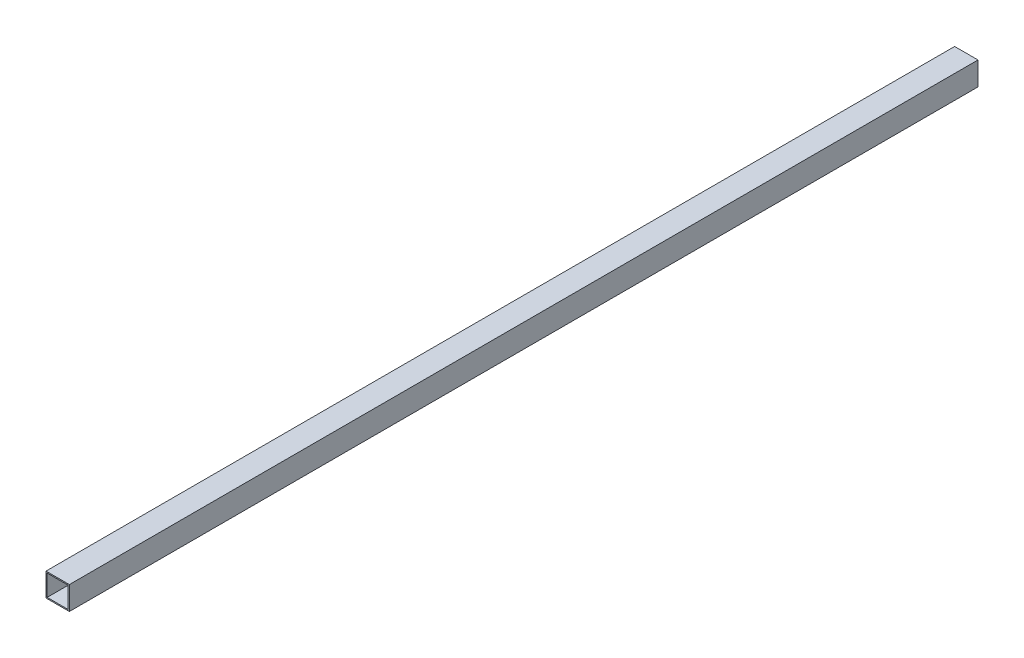
ISO-10303-21;
HEADER;
FILE_DESCRIPTION(('STEP AP214'),'2;1');
FILE_NAME('part.step','',(''),(''),'','','');
FILE_SCHEMA(('AUTOMOTIVE_DESIGN { 1 0 10303 214 1 1 1 1 }'));
ENDSEC;
DATA;
#1=APPLICATION_CONTEXT('core data for automotive mechanical design processes');
#2=APPLICATION_PROTOCOL_DEFINITION('international standard','automotive_design',2000,#1);
#3=PRODUCT_CONTEXT('',#1,'mechanical');
#4=PRODUCT('Part','Part','',(#3));
#5=PRODUCT_RELATED_PRODUCT_CATEGORY('part','',(#4));
#6=PRODUCT_DEFINITION_FORMATION('','',#4);
#7=PRODUCT_DEFINITION_CONTEXT('part definition',#1,'design');
#8=PRODUCT_DEFINITION('design','',#6,#7);
#9=PRODUCT_DEFINITION_SHAPE('','',#8);
#10=(LENGTH_UNIT() NAMED_UNIT(*) SI_UNIT(.MILLI.,.METRE.));
#11=(NAMED_UNIT(*) PLANE_ANGLE_UNIT() SI_UNIT($,.RADIAN.));
#12=(NAMED_UNIT(*) SI_UNIT($,.STERADIAN.) SOLID_ANGLE_UNIT());
#13=UNCERTAINTY_MEASURE_WITH_UNIT(LENGTH_MEASURE(1.E-05),#10,'distance_accuracy_value','');
#14=(GEOMETRIC_REPRESENTATION_CONTEXT(3) GLOBAL_UNCERTAINTY_ASSIGNED_CONTEXT((#13)) GLOBAL_UNIT_ASSIGNED_CONTEXT((#10,
#11,#12)) REPRESENTATION_CONTEXT('',''));
#15=CARTESIAN_POINT('',(0.,0.,0.));
#16=DIRECTION('',(0.,0.,1.));
#17=DIRECTION('',(1.,0.,0.));
#18=AXIS2_PLACEMENT_3D('',#15,#16,#17);
#19=CARTESIAN_POINT('',(0.,0.,1235.));
#20=DIRECTION('',(0.,0.,1.));
#21=DIRECTION('',(1.,0.,0.));
#22=AXIS2_PLACEMENT_3D('',#19,#20,#21);
#23=PLANE('',#22);
#24=DIRECTION('',(0.,1.,0.));
#25=VECTOR('',#24,1.);
#26=CARTESIAN_POINT('',(15.875,15.875,1235.));
#27=LINE('',#26,#25);
#28=CARTESIAN_POINT('',(15.875,-15.875,1235.));
#29=VERTEX_POINT('',#28);
#30=CARTESIAN_POINT('',(15.875,15.875,1235.));
#31=VERTEX_POINT('',#30);
#32=EDGE_CURVE('E134',#29,#31,#27,.T.);
#33=ORIENTED_EDGE('',*,*,#32,.T.);
#34=DIRECTION('',(-1.,0.,0.));
#35=VECTOR('',#34,1.);
#36=CARTESIAN_POINT('',(-15.875,15.875,1235.));
#37=LINE('',#36,#35);
#38=CARTESIAN_POINT('',(-15.875,15.875,1235.));
#39=VERTEX_POINT('',#38);
#40=EDGE_CURVE('E137',#31,#39,#37,.T.);
#41=ORIENTED_EDGE('',*,*,#40,.T.);
#42=DIRECTION('',(0.,-1.,0.));
#43=VECTOR('',#42,1.);
#44=CARTESIAN_POINT('',(-15.875,15.875,1235.));
#45=LINE('',#44,#43);
#46=CARTESIAN_POINT('',(-15.875,-15.875,1235.));
#47=VERTEX_POINT('',#46);
#48=EDGE_CURVE('E140',#39,#47,#45,.T.);
#49=ORIENTED_EDGE('',*,*,#48,.T.);
#50=DIRECTION('',(1.,0.,0.));
#51=VECTOR('',#50,1.);
#52=CARTESIAN_POINT('',(-15.875,-15.875,1235.));
#53=LINE('',#52,#51);
#54=EDGE_CURVE('E142',#47,#29,#53,.T.);
#55=ORIENTED_EDGE('',*,*,#54,.T.);
#56=EDGE_LOOP('',(#33,#41,#49,#55));
#57=FACE_BOUND('',#56,.T.);
#58=DIRECTION('',(-1.,0.,0.));
#59=VECTOR('',#58,1.);
#60=CARTESIAN_POINT('',(-14.2875,14.2875,1235.));
#61=LINE('',#60,#59);
#62=CARTESIAN_POINT('',(14.2875,14.2875,1235.));
#63=VERTEX_POINT('',#62);
#64=CARTESIAN_POINT('',(-14.2875,14.2875,1235.));
#65=VERTEX_POINT('',#64);
#66=EDGE_CURVE('E106',#63,#65,#61,.T.);
#67=ORIENTED_EDGE('',*,*,#66,.F.);
#68=DIRECTION('',(0.,1.,0.));
#69=VECTOR('',#68,1.);
#70=CARTESIAN_POINT('',(14.2875,14.2875,1235.));
#71=LINE('',#70,#69);
#72=CARTESIAN_POINT('',(14.2875,-14.2875,1235.));
#73=VERTEX_POINT('',#72);
#74=EDGE_CURVE('E98',#73,#63,#71,.T.);
#75=ORIENTED_EDGE('',*,*,#74,.F.);
#76=DIRECTION('',(1.,0.,0.));
#77=VECTOR('',#76,1.);
#78=CARTESIAN_POINT('',(-14.2875,-14.2875,1235.));
#79=LINE('',#78,#77);
#80=CARTESIAN_POINT('',(-14.2875,-14.2875,1235.));
#81=VERTEX_POINT('',#80);
#82=EDGE_CURVE('E120',#81,#73,#79,.T.);
#83=ORIENTED_EDGE('',*,*,#82,.F.);
#84=DIRECTION('',(0.,-1.,0.));
#85=VECTOR('',#84,1.);
#86=CARTESIAN_POINT('',(-14.2875,14.2875,1235.));
#87=LINE('',#86,#85);
#88=EDGE_CURVE('E118',#65,#81,#87,.T.);
#89=ORIENTED_EDGE('',*,*,#88,.F.);
#90=EDGE_LOOP('',(#67,#75,#83,#89));
#91=FACE_BOUND('',#90,.T.);
#92=ADVANCED_FACE('F33',(#57,#91),#23,.T.);
#93=CARTESIAN_POINT('',(0.,0.,0.));
#94=DIRECTION('',(0.,0.,1.));
#95=DIRECTION('',(1.,0.,0.));
#96=AXIS2_PLACEMENT_3D('',#93,#94,#95);
#97=PLANE('',#96);
#98=DIRECTION('',(0.,1.,0.));
#99=VECTOR('',#98,1.);
#100=CARTESIAN_POINT('',(15.875,15.875,0.));
#101=LINE('',#100,#99);
#102=CARTESIAN_POINT('',(15.875,-15.875,0.));
#103=VERTEX_POINT('',#102);
#104=CARTESIAN_POINT('',(15.875,15.875,0.));
#105=VERTEX_POINT('',#104);
#106=EDGE_CURVE('E114',#103,#105,#101,.T.);
#107=ORIENTED_EDGE('',*,*,#106,.F.);
#108=DIRECTION('',(1.,0.,0.));
#109=VECTOR('',#108,1.);
#110=CARTESIAN_POINT('',(-15.875,-15.875,0.));
#111=LINE('',#110,#109);
#112=CARTESIAN_POINT('',(-15.875,-15.875,0.));
#113=VERTEX_POINT('',#112);
#114=EDGE_CURVE('E138',#113,#103,#111,.T.);
#115=ORIENTED_EDGE('',*,*,#114,.F.);
#116=DIRECTION('',(0.,-1.,0.));
#117=VECTOR('',#116,1.);
#118=CARTESIAN_POINT('',(-15.875,15.875,0.));
#119=LINE('',#118,#117);
#120=CARTESIAN_POINT('',(-15.875,15.875,0.));
#121=VERTEX_POINT('',#120);
#122=EDGE_CURVE('E149',#121,#113,#119,.T.);
#123=ORIENTED_EDGE('',*,*,#122,.F.);
#124=DIRECTION('',(-1.,0.,0.));
#125=VECTOR('',#124,1.);
#126=CARTESIAN_POINT('',(-15.875,15.875,0.));
#127=LINE('',#126,#125);
#128=EDGE_CURVE('E147',#105,#121,#127,.T.);
#129=ORIENTED_EDGE('',*,*,#128,.F.);
#130=EDGE_LOOP('',(#107,#115,#123,#129));
#131=FACE_BOUND('',#130,.T.);
#132=DIRECTION('',(0.,1.,0.));
#133=VECTOR('',#132,1.);
#134=CARTESIAN_POINT('',(14.2875,14.2875,0.));
#135=LINE('',#134,#133);
#136=CARTESIAN_POINT('',(14.2875,-14.2875,0.));
#137=VERTEX_POINT('',#136);
#138=CARTESIAN_POINT('',(14.2875,14.2875,0.));
#139=VERTEX_POINT('',#138);
#140=EDGE_CURVE('E56',#137,#139,#135,.T.);
#141=ORIENTED_EDGE('',*,*,#140,.T.);
#142=DIRECTION('',(-1.,0.,0.));
#143=VECTOR('',#142,1.);
#144=CARTESIAN_POINT('',(-14.2875,14.2875,0.));
#145=LINE('',#144,#143);
#146=CARTESIAN_POINT('',(-14.2875,14.2875,0.));
#147=VERTEX_POINT('',#146);
#148=EDGE_CURVE('E113',#139,#147,#145,.T.);
#149=ORIENTED_EDGE('',*,*,#148,.T.);
#150=DIRECTION('',(0.,-1.,0.));
#151=VECTOR('',#150,1.);
#152=CARTESIAN_POINT('',(-14.2875,14.2875,0.));
#153=LINE('',#152,#151);
#154=CARTESIAN_POINT('',(-14.2875,-14.2875,0.));
#155=VERTEX_POINT('',#154);
#156=EDGE_CURVE('E126',#147,#155,#153,.T.);
#157=ORIENTED_EDGE('',*,*,#156,.T.);
#158=DIRECTION('',(1.,0.,0.));
#159=VECTOR('',#158,1.);
#160=CARTESIAN_POINT('',(-14.2875,-14.2875,0.));
#161=LINE('',#160,#159);
#162=EDGE_CURVE('E107',#155,#137,#161,.T.);
#163=ORIENTED_EDGE('',*,*,#162,.T.);
#164=EDGE_LOOP('',(#141,#149,#157,#163));
#165=FACE_BOUND('',#164,.T.);
#166=ADVANCED_FACE('F167',(#131,#165),#97,.F.);
#167=CARTESIAN_POINT('',(15.875,15.875,1235.));
#168=DIRECTION('',(-1.,0.,0.));
#169=DIRECTION('',(0.,-1.,0.));
#170=AXIS2_PLACEMENT_3D('',#167,#168,#169);
#171=PLANE('',#170);
#172=ORIENTED_EDGE('',*,*,#106,.T.);
#173=DIRECTION('',(0.,0.,-1.));
#174=VECTOR('',#173,1.);
#175=CARTESIAN_POINT('',(15.875,15.875,1235.));
#176=LINE('',#175,#174);
#177=EDGE_CURVE('E11',#31,#105,#176,.T.);
#178=ORIENTED_EDGE('',*,*,#177,.F.);
#179=ORIENTED_EDGE('',*,*,#32,.F.);
#180=DIRECTION('',(0.,0.,-1.));
#181=VECTOR('',#180,1.);
#182=CARTESIAN_POINT('',(15.875,-15.875,1235.));
#183=LINE('',#182,#181);
#184=EDGE_CURVE('E144',#29,#103,#183,.T.);
#185=ORIENTED_EDGE('',*,*,#184,.T.);
#186=EDGE_LOOP('',(#172,#178,#179,#185));
#187=FACE_BOUND('',#186,.T.);
#188=ADVANCED_FACE('F35',(#187),#171,.F.);
#189=CARTESIAN_POINT('',(-15.875,15.875,1235.));
#190=DIRECTION('',(0.,-1.,0.));
#191=DIRECTION('',(0.,0.,-1.));
#192=AXIS2_PLACEMENT_3D('',#189,#190,#191);
#193=PLANE('',#192);
#194=ORIENTED_EDGE('',*,*,#128,.T.);
#195=DIRECTION('',(0.,0.,-1.));
#196=VECTOR('',#195,1.);
#197=CARTESIAN_POINT('',(-15.875,15.875,1235.));
#198=LINE('',#197,#196);
#199=EDGE_CURVE('E41',#39,#121,#198,.T.);
#200=ORIENTED_EDGE('',*,*,#199,.F.);
#201=ORIENTED_EDGE('',*,*,#40,.F.);
#202=ORIENTED_EDGE('',*,*,#177,.T.);
#203=EDGE_LOOP('',(#194,#200,#201,#202));
#204=FACE_BOUND('',#203,.T.);
#205=ADVANCED_FACE('F177',(#204),#193,.F.);
#206=CARTESIAN_POINT('',(-15.875,15.875,1235.));
#207=DIRECTION('',(1.,0.,0.));
#208=DIRECTION('',(0.,0.,-1.));
#209=AXIS2_PLACEMENT_3D('',#206,#207,#208);
#210=PLANE('',#209);
#211=ORIENTED_EDGE('',*,*,#122,.T.);
#212=DIRECTION('',(0.,0.,-1.));
#213=VECTOR('',#212,1.);
#214=CARTESIAN_POINT('',(-15.875,-15.875,1235.));
#215=LINE('',#214,#213);
#216=EDGE_CURVE('E154',#47,#113,#215,.T.);
#217=ORIENTED_EDGE('',*,*,#216,.F.);
#218=ORIENTED_EDGE('',*,*,#48,.F.);
#219=ORIENTED_EDGE('',*,*,#199,.T.);
#220=EDGE_LOOP('',(#211,#217,#218,#219));
#221=FACE_BOUND('',#220,.T.);
#222=ADVANCED_FACE('F161',(#221),#210,.F.);
#223=CARTESIAN_POINT('',(-15.875,-15.875,1235.));
#224=DIRECTION('',(0.,1.,0.));
#225=DIRECTION('',(0.,0.,1.));
#226=AXIS2_PLACEMENT_3D('',#223,#224,#225);
#227=PLANE('',#226);
#228=ORIENTED_EDGE('',*,*,#114,.T.);
#229=ORIENTED_EDGE('',*,*,#184,.F.);
#230=ORIENTED_EDGE('',*,*,#54,.F.);
#231=ORIENTED_EDGE('',*,*,#216,.T.);
#232=EDGE_LOOP('',(#228,#229,#230,#231));
#233=FACE_BOUND('',#232,.T.);
#234=ADVANCED_FACE('F171',(#233),#227,.F.);
#235=CARTESIAN_POINT('',(14.2875,14.2875,1235.));
#236=DIRECTION('',(-1.,0.,0.));
#237=DIRECTION('',(0.,0.,1.));
#238=AXIS2_PLACEMENT_3D('',#235,#236,#237);
#239=PLANE('',#238);
#240=ORIENTED_EDGE('',*,*,#140,.F.);
#241=DIRECTION('',(0.,0.,-1.));
#242=VECTOR('',#241,1.);
#243=CARTESIAN_POINT('',(14.2875,-14.2875,1235.));
#244=LINE('',#243,#242);
#245=EDGE_CURVE('E102',#73,#137,#244,.T.);
#246=ORIENTED_EDGE('',*,*,#245,.F.);
#247=ORIENTED_EDGE('',*,*,#74,.T.);
#248=DIRECTION('',(0.,0.,-1.));
#249=VECTOR('',#248,1.);
#250=CARTESIAN_POINT('',(14.2875,14.2875,1235.));
#251=LINE('',#250,#249);
#252=EDGE_CURVE('E101',#63,#139,#251,.T.);
#253=ORIENTED_EDGE('',*,*,#252,.T.);
#254=EDGE_LOOP('',(#240,#246,#247,#253));
#255=FACE_BOUND('',#254,.T.);
#256=ADVANCED_FACE('F100',(#255),#239,.T.);
#257=CARTESIAN_POINT('',(-14.2875,14.2875,1235.));
#258=DIRECTION('',(0.,-1.,0.));
#259=DIRECTION('',(0.,0.,-1.));
#260=AXIS2_PLACEMENT_3D('',#257,#258,#259);
#261=PLANE('',#260);
#262=ORIENTED_EDGE('',*,*,#148,.F.);
#263=ORIENTED_EDGE('',*,*,#252,.F.);
#264=ORIENTED_EDGE('',*,*,#66,.T.);
#265=DIRECTION('',(0.,0.,-1.));
#266=VECTOR('',#265,1.);
#267=CARTESIAN_POINT('',(-14.2875,14.2875,1235.));
#268=LINE('',#267,#266);
#269=EDGE_CURVE('E115',#65,#147,#268,.T.);
#270=ORIENTED_EDGE('',*,*,#269,.T.);
#271=EDGE_LOOP('',(#262,#263,#264,#270));
#272=FACE_BOUND('',#271,.T.);
#273=ADVANCED_FACE('F110',(#272),#261,.T.);
#274=CARTESIAN_POINT('',(-14.2875,14.2875,1235.));
#275=DIRECTION('',(1.,0.,0.));
#276=DIRECTION('',(0.,0.,-1.));
#277=AXIS2_PLACEMENT_3D('',#274,#275,#276);
#278=PLANE('',#277);
#279=ORIENTED_EDGE('',*,*,#156,.F.);
#280=ORIENTED_EDGE('',*,*,#269,.F.);
#281=ORIENTED_EDGE('',*,*,#88,.T.);
#282=DIRECTION('',(0.,0.,-1.));
#283=VECTOR('',#282,1.);
#284=CARTESIAN_POINT('',(-14.2875,-14.2875,1235.));
#285=LINE('',#284,#283);
#286=EDGE_CURVE('E48',#81,#155,#285,.T.);
#287=ORIENTED_EDGE('',*,*,#286,.T.);
#288=EDGE_LOOP('',(#279,#280,#281,#287));
#289=FACE_BOUND('',#288,.T.);
#290=ADVANCED_FACE('F200',(#289),#278,.T.);
#291=CARTESIAN_POINT('',(-14.2875,-14.2875,1235.));
#292=DIRECTION('',(0.,1.,0.));
#293=DIRECTION('',(0.,0.,1.));
#294=AXIS2_PLACEMENT_3D('',#291,#292,#293);
#295=PLANE('',#294);
#296=ORIENTED_EDGE('',*,*,#162,.F.);
#297=ORIENTED_EDGE('',*,*,#286,.F.);
#298=ORIENTED_EDGE('',*,*,#82,.T.);
#299=ORIENTED_EDGE('',*,*,#245,.T.);
#300=EDGE_LOOP('',(#296,#297,#298,#299));
#301=FACE_BOUND('',#300,.T.);
#302=ADVANCED_FACE('F204',(#301),#295,.T.);
#303=CLOSED_SHELL('',(#92,#166,#188,#205,#222,#234,#256,#273,#290,#302));
#304=MANIFOLD_SOLID_BREP('B2',#303);
#305=ADVANCED_BREP_SHAPE_REPRESENTATION('',(#18,#304),#14);
#306=SHAPE_DEFINITION_REPRESENTATION(#9,#305);
ENDSEC;
END-ISO-10303-21;
